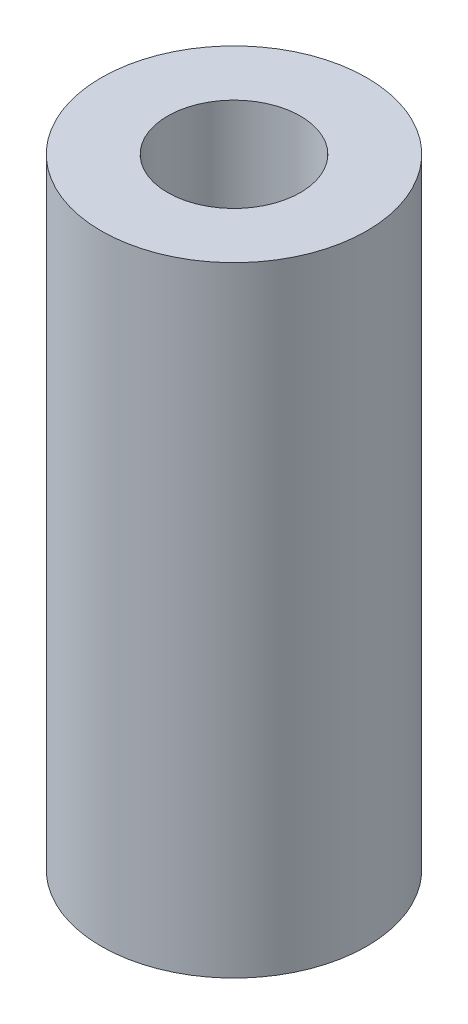
ISO-10303-21;
HEADER;
FILE_DESCRIPTION(('STEP AP214'),'2;1');
FILE_NAME('part.step','',(''),(''),'','','');
FILE_SCHEMA(('AUTOMOTIVE_DESIGN { 1 0 10303 214 1 1 1 1 }'));
ENDSEC;
DATA;
#1=APPLICATION_CONTEXT('core data for automotive mechanical design processes');
#2=APPLICATION_PROTOCOL_DEFINITION('international standard','automotive_design',2000,#1);
#3=PRODUCT_CONTEXT('',#1,'mechanical');
#4=PRODUCT('Part','Part','',(#3));
#5=PRODUCT_RELATED_PRODUCT_CATEGORY('part','',(#4));
#6=PRODUCT_DEFINITION_FORMATION('','',#4);
#7=PRODUCT_DEFINITION_CONTEXT('part definition',#1,'design');
#8=PRODUCT_DEFINITION('design','',#6,#7);
#9=PRODUCT_DEFINITION_SHAPE('','',#8);
#10=(LENGTH_UNIT() NAMED_UNIT(*) SI_UNIT(.MILLI.,.METRE.));
#11=(NAMED_UNIT(*) PLANE_ANGLE_UNIT() SI_UNIT($,.RADIAN.));
#12=(NAMED_UNIT(*) SI_UNIT($,.STERADIAN.) SOLID_ANGLE_UNIT());
#13=UNCERTAINTY_MEASURE_WITH_UNIT(LENGTH_MEASURE(1.E-05),#10,'distance_accuracy_value','');
#14=(GEOMETRIC_REPRESENTATION_CONTEXT(3) GLOBAL_UNCERTAINTY_ASSIGNED_CONTEXT((#13)) GLOBAL_UNIT_ASSIGNED_CONTEXT((#10,
#11,#12)) REPRESENTATION_CONTEXT('',''));
#15=CARTESIAN_POINT('',(0.,0.,0.));
#16=DIRECTION('',(0.,0.,1.));
#17=DIRECTION('',(1.,0.,0.));
#18=AXIS2_PLACEMENT_3D('',#15,#16,#17);
#19=CARTESIAN_POINT('',(0.,28.,0.));
#20=DIRECTION('',(0.,1.,0.));
#21=DIRECTION('',(0.,0.,1.));
#22=AXIS2_PLACEMENT_3D('',#19,#20,#21);
#23=PLANE('',#22);
#24=CARTESIAN_POINT('',(0.,28.,0.));
#25=DIRECTION('',(0.,1.,0.));
#26=DIRECTION('',(0.,0.,1.));
#27=AXIS2_PLACEMENT_3D('',#24,#25,#26);
#28=CIRCLE('',#27,6.);
#29=CARTESIAN_POINT('',(0.,28.,6.));
#30=VERTEX_POINT('',#29);
#31=EDGE_CURVE('E10',#30,#30,#28,.T.);
#32=ORIENTED_EDGE('',*,*,#31,.T.);
#33=EDGE_LOOP('',(#32));
#34=FACE_BOUND('',#33,.T.);
#35=CARTESIAN_POINT('',(0.,28.,0.));
#36=DIRECTION('',(0.,1.,0.));
#37=DIRECTION('',(0.,0.,1.));
#38=AXIS2_PLACEMENT_3D('',#35,#36,#37);
#39=CIRCLE('',#38,3.);
#40=CARTESIAN_POINT('',(0.,28.,3.));
#41=VERTEX_POINT('',#40);
#42=EDGE_CURVE('E48',#41,#41,#39,.T.);
#43=ORIENTED_EDGE('',*,*,#42,.F.);
#44=EDGE_LOOP('',(#43));
#45=FACE_BOUND('',#44,.T.);
#46=ADVANCED_FACE('F37',(#34,#45),#23,.T.);
#47=CARTESIAN_POINT('',(0.,0.,0.));
#48=DIRECTION('',(0.,1.,0.));
#49=DIRECTION('',(0.,0.,1.));
#50=AXIS2_PLACEMENT_3D('',#47,#48,#49);
#51=PLANE('',#50);
#52=CARTESIAN_POINT('',(0.,0.,0.));
#53=DIRECTION('',(0.,1.,0.));
#54=DIRECTION('',(0.,0.,1.));
#55=AXIS2_PLACEMENT_3D('',#52,#53,#54);
#56=CIRCLE('',#55,6.);
#57=CARTESIAN_POINT('',(0.,0.,6.));
#58=VERTEX_POINT('',#57);
#59=EDGE_CURVE('E41',#58,#58,#56,.T.);
#60=ORIENTED_EDGE('',*,*,#59,.F.);
#61=EDGE_LOOP('',(#60));
#62=FACE_BOUND('',#61,.T.);
#63=CARTESIAN_POINT('',(0.,0.,0.));
#64=DIRECTION('',(0.,1.,0.));
#65=DIRECTION('',(0.,0.,1.));
#66=AXIS2_PLACEMENT_3D('',#63,#64,#65);
#67=CIRCLE('',#66,3.);
#68=CARTESIAN_POINT('',(0.,0.,3.));
#69=VERTEX_POINT('',#68);
#70=EDGE_CURVE('E50',#69,#69,#67,.T.);
#71=ORIENTED_EDGE('',*,*,#70,.T.);
#72=EDGE_LOOP('',(#71));
#73=FACE_BOUND('',#72,.T.);
#74=ADVANCED_FACE('F60',(#62,#73),#51,.F.);
#75=CARTESIAN_POINT('',(0.,28.,0.));
#76=DIRECTION('',(0.,-1.,0.));
#77=DIRECTION('',(0.,0.,-1.));
#78=AXIS2_PLACEMENT_3D('',#75,#76,#77);
#79=CYLINDRICAL_SURFACE('',#78,6.);
#80=ORIENTED_EDGE('',*,*,#31,.F.);
#81=EDGE_LOOP('',(#80));
#82=FACE_BOUND('',#81,.T.);
#83=ORIENTED_EDGE('',*,*,#59,.T.);
#84=EDGE_LOOP('',(#83));
#85=FACE_BOUND('',#84,.T.);
#86=ADVANCED_FACE('F39',(#82,#85),#79,.T.);
#87=CARTESIAN_POINT('',(0.,28.,0.));
#88=DIRECTION('',(0.,-1.,0.));
#89=DIRECTION('',(0.,0.,-1.));
#90=AXIS2_PLACEMENT_3D('',#87,#88,#89);
#91=CYLINDRICAL_SURFACE('',#90,3.);
#92=ORIENTED_EDGE('',*,*,#42,.T.);
#93=EDGE_LOOP('',(#92));
#94=FACE_BOUND('',#93,.T.);
#95=ORIENTED_EDGE('',*,*,#70,.F.);
#96=EDGE_LOOP('',(#95));
#97=FACE_BOUND('',#96,.T.);
#98=ADVANCED_FACE('F56',(#94,#97),#91,.F.);
#99=CLOSED_SHELL('',(#46,#74,#86,#98));
#100=MANIFOLD_SOLID_BREP('B2',#99);
#101=ADVANCED_BREP_SHAPE_REPRESENTATION('',(#18,#100),#14);
#102=SHAPE_DEFINITION_REPRESENTATION(#9,#101);
ENDSEC;
END-ISO-10303-21;
